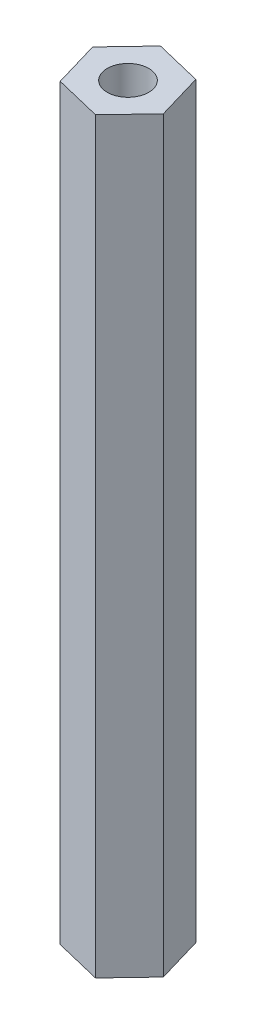
ISO-10303-21;
HEADER;
FILE_DESCRIPTION(('STEP AP214'),'2;1');
FILE_NAME('part.step','',(''),(''),'','','');
FILE_SCHEMA(('AUTOMOTIVE_DESIGN { 1 0 10303 214 1 1 1 1 }'));
ENDSEC;
DATA;
#1=APPLICATION_CONTEXT('core data for automotive mechanical design processes');
#2=APPLICATION_PROTOCOL_DEFINITION('international standard','automotive_design',2000,#1);
#3=PRODUCT_CONTEXT('',#1,'mechanical');
#4=PRODUCT('Part','Part','',(#3));
#5=PRODUCT_RELATED_PRODUCT_CATEGORY('part','',(#4));
#6=PRODUCT_DEFINITION_FORMATION('','',#4);
#7=PRODUCT_DEFINITION_CONTEXT('part definition',#1,'design');
#8=PRODUCT_DEFINITION('design','',#6,#7);
#9=PRODUCT_DEFINITION_SHAPE('','',#8);
#10=(LENGTH_UNIT() NAMED_UNIT(*) SI_UNIT(.MILLI.,.METRE.));
#11=(NAMED_UNIT(*) PLANE_ANGLE_UNIT() SI_UNIT($,.RADIAN.));
#12=(NAMED_UNIT(*) SI_UNIT($,.STERADIAN.) SOLID_ANGLE_UNIT());
#13=UNCERTAINTY_MEASURE_WITH_UNIT(LENGTH_MEASURE(1.E-05),#10,'distance_accuracy_value','');
#14=(GEOMETRIC_REPRESENTATION_CONTEXT(3) GLOBAL_UNCERTAINTY_ASSIGNED_CONTEXT((#13)) GLOBAL_UNIT_ASSIGNED_CONTEXT((#10,
#11,#12)) REPRESENTATION_CONTEXT('',''));
#15=CARTESIAN_POINT('',(0.,0.,0.));
#16=DIRECTION('',(0.,0.,1.));
#17=DIRECTION('',(1.,0.,0.));
#18=AXIS2_PLACEMENT_3D('',#15,#16,#17);
#19=CARTESIAN_POINT('',(0.,27.,0.));
#20=DIRECTION('',(0.,1.,0.));
#21=DIRECTION('',(0.,0.,1.));
#22=AXIS2_PLACEMENT_3D('',#19,#20,#21);
#23=PLANE('',#22);
#24=DIRECTION('',(0.971906320154711,0.,0.235368020009788));
#25=VECTOR('',#24,1.);
#26=CARTESIAN_POINT('',(-2.38949518673463,27.,2.50804959133029));
#27=LINE('',#26,#25);
#28=CARTESIAN_POINT('',(-2.38949518673463,27.,2.50804959133029));
#29=VERTEX_POINT('',#28);
#30=CARTESIAN_POINT('',(0.9772870666759,27.,3.32338832959798));
#31=VERTEX_POINT('',#30);
#32=EDGE_CURVE('E133',#29,#31,#27,.T.);
#33=ORIENTED_EDGE('',*,*,#32,.T.);
#34=DIRECTION('',(0.689787844644276,0.,-0.724011553347738));
#35=VECTOR('',#34,1.);
#36=CARTESIAN_POINT('',(0.9772870666759,27.,3.32338832959798));
#37=LINE('',#36,#35);
#38=CARTESIAN_POINT('',(3.36678225341053,27.,0.815338738267681));
#39=VERTEX_POINT('',#38);
#40=EDGE_CURVE('E91',#31,#39,#37,.T.);
#41=ORIENTED_EDGE('',*,*,#40,.T.);
#42=DIRECTION('',(-0.282118475510435,0.,-0.959379573357526));
#43=VECTOR('',#42,1.);
#44=CARTESIAN_POINT('',(3.36678225341053,27.,0.815338738267681));
#45=LINE('',#44,#43);
#46=CARTESIAN_POINT('',(2.38949518673463,27.,-2.50804959133029));
#47=VERTEX_POINT('',#46);
#48=EDGE_CURVE('E104',#39,#47,#45,.T.);
#49=ORIENTED_EDGE('',*,*,#48,.T.);
#50=DIRECTION('',(-0.971906320154711,0.,-0.235368020009788));
#51=VECTOR('',#50,1.);
#52=CARTESIAN_POINT('',(2.38949518673463,27.,-2.50804959133029));
#53=LINE('',#52,#51);
#54=CARTESIAN_POINT('',(-0.977287066675899,27.,-3.32338832959798));
#55=VERTEX_POINT('',#54);
#56=EDGE_CURVE('E98',#47,#55,#53,.T.);
#57=ORIENTED_EDGE('',*,*,#56,.T.);
#58=DIRECTION('',(-0.689787844644276,0.,0.724011553347738));
#59=VECTOR('',#58,1.);
#60=CARTESIAN_POINT('',(-0.977287066675899,27.,-3.32338832959798));
#61=LINE('',#60,#59);
#62=CARTESIAN_POINT('',(-3.36678225341053,27.,-0.815338738267681));
#63=VERTEX_POINT('',#62);
#64=EDGE_CURVE('E102',#55,#63,#61,.T.);
#65=ORIENTED_EDGE('',*,*,#64,.T.);
#66=DIRECTION('',(0.282118475510435,0.,0.959379573357526));
#67=VECTOR('',#66,1.);
#68=CARTESIAN_POINT('',(-3.36678225341053,27.,-0.815338738267681));
#69=LINE('',#68,#67);
#70=EDGE_CURVE('E54',#63,#29,#69,.T.);
#71=ORIENTED_EDGE('',*,*,#70,.T.);
#72=EDGE_LOOP('',(#33,#41,#49,#57,#65,#71));
#73=FACE_BOUND('',#72,.T.);
#74=CARTESIAN_POINT('',(0.,27.,0.));
#75=DIRECTION('',(0.,1.,0.));
#76=DIRECTION('',(0.,0.,1.));
#77=AXIS2_PLACEMENT_3D('',#74,#75,#76);
#78=CIRCLE('',#77,1.5);
#79=CARTESIAN_POINT('',(0.,27.,1.5));
#80=VERTEX_POINT('',#79);
#81=EDGE_CURVE('E126',#80,#80,#78,.T.);
#82=ORIENTED_EDGE('',*,*,#81,.F.);
#83=EDGE_LOOP('',(#82));
#84=FACE_BOUND('',#83,.T.);
#85=ADVANCED_FACE('F37',(#73,#84),#23,.T.);
#86=CARTESIAN_POINT('',(0.,-27.,0.));
#87=DIRECTION('',(0.,1.,0.));
#88=DIRECTION('',(0.,0.,1.));
#89=AXIS2_PLACEMENT_3D('',#86,#87,#88);
#90=PLANE('',#89);
#91=DIRECTION('',(0.971906320154711,0.,0.235368020009788));
#92=VECTOR('',#91,1.);
#93=CARTESIAN_POINT('',(-2.38949518673463,-27.,2.50804959133029));
#94=LINE('',#93,#92);
#95=CARTESIAN_POINT('',(-2.38949518673463,-27.,2.50804959133029));
#96=VERTEX_POINT('',#95);
#97=CARTESIAN_POINT('',(0.9772870666759,-27.,3.32338832959798));
#98=VERTEX_POINT('',#97);
#99=EDGE_CURVE('E122',#96,#98,#94,.T.);
#100=ORIENTED_EDGE('',*,*,#99,.F.);
#101=DIRECTION('',(0.282118475510435,0.,0.959379573357526));
#102=VECTOR('',#101,1.);
#103=CARTESIAN_POINT('',(-3.36678225341053,-27.,-0.815338738267681));
#104=LINE('',#103,#102);
#105=CARTESIAN_POINT('',(-3.36678225341053,-27.,-0.815338738267681));
#106=VERTEX_POINT('',#105);
#107=EDGE_CURVE('E83',#106,#96,#104,.T.);
#108=ORIENTED_EDGE('',*,*,#107,.F.);
#109=DIRECTION('',(-0.689787844644276,0.,0.724011553347738));
#110=VECTOR('',#109,1.);
#111=CARTESIAN_POINT('',(-0.977287066675899,-27.,-3.32338832959798));
#112=LINE('',#111,#110);
#113=CARTESIAN_POINT('',(-0.977287066675899,-27.,-3.32338832959798));
#114=VERTEX_POINT('',#113);
#115=EDGE_CURVE('E77',#114,#106,#112,.T.);
#116=ORIENTED_EDGE('',*,*,#115,.F.);
#117=DIRECTION('',(-0.971906320154711,0.,-0.235368020009788));
#118=VECTOR('',#117,1.);
#119=CARTESIAN_POINT('',(2.38949518673463,-27.,-2.50804959133029));
#120=LINE('',#119,#118);
#121=CARTESIAN_POINT('',(2.38949518673463,-27.,-2.50804959133029));
#122=VERTEX_POINT('',#121);
#123=EDGE_CURVE('E112',#122,#114,#120,.T.);
#124=ORIENTED_EDGE('',*,*,#123,.F.);
#125=DIRECTION('',(-0.282118475510435,0.,-0.959379573357526));
#126=VECTOR('',#125,1.);
#127=CARTESIAN_POINT('',(3.36678225341053,-27.,0.815338738267681));
#128=LINE('',#127,#126);
#129=CARTESIAN_POINT('',(3.36678225341053,-27.,0.815338738267681));
#130=VERTEX_POINT('',#129);
#131=EDGE_CURVE('E128',#130,#122,#128,.T.);
#132=ORIENTED_EDGE('',*,*,#131,.F.);
#133=DIRECTION('',(0.689787844644276,0.,-0.724011553347738));
#134=VECTOR('',#133,1.);
#135=CARTESIAN_POINT('',(0.9772870666759,-27.,3.32338832959798));
#136=LINE('',#135,#134);
#137=EDGE_CURVE('E125',#98,#130,#136,.T.);
#138=ORIENTED_EDGE('',*,*,#137,.F.);
#139=EDGE_LOOP('',(#100,#108,#116,#124,#132,#138));
#140=FACE_BOUND('',#139,.T.);
#141=CARTESIAN_POINT('',(0.,-27.,0.));
#142=DIRECTION('',(0.,1.,0.));
#143=DIRECTION('',(0.,0.,1.));
#144=AXIS2_PLACEMENT_3D('',#141,#142,#143);
#145=CIRCLE('',#144,1.5);
#146=CARTESIAN_POINT('',(0.,-27.,1.5));
#147=VERTEX_POINT('',#146);
#148=EDGE_CURVE('E226',#147,#147,#145,.T.);
#149=ORIENTED_EDGE('',*,*,#148,.T.);
#150=EDGE_LOOP('',(#149));
#151=FACE_BOUND('',#150,.T.);
#152=ADVANCED_FACE('F142',(#140,#151),#90,.F.);
#153=CARTESIAN_POINT('',(-2.38949518673463,27.,2.50804959133029));
#154=DIRECTION('',(0.235368020009788,0.,-0.971906320154711));
#155=DIRECTION('',(-0.971906320154711,0.,-0.235368020009788));
#156=AXIS2_PLACEMENT_3D('',#153,#154,#155);
#157=PLANE('',#156);
#158=ORIENTED_EDGE('',*,*,#99,.T.);
#159=DIRECTION('',(0.,-1.,0.));
#160=VECTOR('',#159,1.);
#161=CARTESIAN_POINT('',(0.9772870666759,27.,3.32338832959798));
#162=LINE('',#161,#160);
#163=EDGE_CURVE('E11',#31,#98,#162,.T.);
#164=ORIENTED_EDGE('',*,*,#163,.F.);
#165=ORIENTED_EDGE('',*,*,#32,.F.);
#166=DIRECTION('',(0.,-1.,0.));
#167=VECTOR('',#166,1.);
#168=CARTESIAN_POINT('',(-2.38949518673463,27.,2.50804959133029));
#169=LINE('',#168,#167);
#170=EDGE_CURVE('E118',#29,#96,#169,.T.);
#171=ORIENTED_EDGE('',*,*,#170,.T.);
#172=EDGE_LOOP('',(#158,#164,#165,#171));
#173=FACE_BOUND('',#172,.T.);
#174=ADVANCED_FACE('F39',(#173),#157,.F.);
#175=CARTESIAN_POINT('',(0.9772870666759,27.,3.32338832959798));
#176=DIRECTION('',(-0.724011553347738,0.,-0.689787844644276));
#177=DIRECTION('',(-0.689787844644276,0.,0.724011553347738));
#178=AXIS2_PLACEMENT_3D('',#175,#176,#177);
#179=PLANE('',#178);
#180=ORIENTED_EDGE('',*,*,#137,.T.);
#181=DIRECTION('',(0.,-1.,0.));
#182=VECTOR('',#181,1.);
#183=CARTESIAN_POINT('',(3.36678225341053,27.,0.815338738267681));
#184=LINE('',#183,#182);
#185=EDGE_CURVE('E46',#39,#130,#184,.T.);
#186=ORIENTED_EDGE('',*,*,#185,.F.);
#187=ORIENTED_EDGE('',*,*,#40,.F.);
#188=ORIENTED_EDGE('',*,*,#163,.T.);
#189=EDGE_LOOP('',(#180,#186,#187,#188));
#190=FACE_BOUND('',#189,.T.);
#191=ADVANCED_FACE('F167',(#190),#179,.F.);
#192=CARTESIAN_POINT('',(3.36678225341053,27.,0.815338738267681));
#193=DIRECTION('',(-0.959379573357526,0.,0.282118475510435));
#194=DIRECTION('',(0.282118475510435,0.,0.959379573357526));
#195=AXIS2_PLACEMENT_3D('',#192,#193,#194);
#196=PLANE('',#195);
#197=ORIENTED_EDGE('',*,*,#131,.T.);
#198=DIRECTION('',(0.,-1.,0.));
#199=VECTOR('',#198,1.);
#200=CARTESIAN_POINT('',(2.38949518673463,27.,-2.50804959133029));
#201=LINE('',#200,#199);
#202=EDGE_CURVE('E113',#47,#122,#201,.T.);
#203=ORIENTED_EDGE('',*,*,#202,.F.);
#204=ORIENTED_EDGE('',*,*,#48,.F.);
#205=ORIENTED_EDGE('',*,*,#185,.T.);
#206=EDGE_LOOP('',(#197,#203,#204,#205));
#207=FACE_BOUND('',#206,.T.);
#208=ADVANCED_FACE('F139',(#207),#196,.F.);
#209=CARTESIAN_POINT('',(2.38949518673463,27.,-2.50804959133029));
#210=DIRECTION('',(-0.235368020009788,0.,0.971906320154711));
#211=DIRECTION('',(0.971906320154711,0.,0.235368020009788));
#212=AXIS2_PLACEMENT_3D('',#209,#210,#211);
#213=PLANE('',#212);
#214=ORIENTED_EDGE('',*,*,#123,.T.);
#215=DIRECTION('',(0.,-1.,0.));
#216=VECTOR('',#215,1.);
#217=CARTESIAN_POINT('',(-0.977287066675899,27.,-3.32338832959798));
#218=LINE('',#217,#216);
#219=EDGE_CURVE('E109',#55,#114,#218,.T.);
#220=ORIENTED_EDGE('',*,*,#219,.F.);
#221=ORIENTED_EDGE('',*,*,#56,.F.);
#222=ORIENTED_EDGE('',*,*,#202,.T.);
#223=EDGE_LOOP('',(#214,#220,#221,#222));
#224=FACE_BOUND('',#223,.T.);
#225=ADVANCED_FACE('F110',(#224),#213,.F.);
#226=CARTESIAN_POINT('',(-0.977287066675899,27.,-3.32338832959798));
#227=DIRECTION('',(0.724011553347738,0.,0.689787844644276));
#228=DIRECTION('',(0.689787844644276,0.,-0.724011553347738));
#229=AXIS2_PLACEMENT_3D('',#226,#227,#228);
#230=PLANE('',#229);
#231=ORIENTED_EDGE('',*,*,#115,.T.);
#232=DIRECTION('',(0.,-1.,0.));
#233=VECTOR('',#232,1.);
#234=CARTESIAN_POINT('',(-3.36678225341053,27.,-0.815338738267681));
#235=LINE('',#234,#233);
#236=EDGE_CURVE('E114',#63,#106,#235,.T.);
#237=ORIENTED_EDGE('',*,*,#236,.F.);
#238=ORIENTED_EDGE('',*,*,#64,.F.);
#239=ORIENTED_EDGE('',*,*,#219,.T.);
#240=EDGE_LOOP('',(#231,#237,#238,#239));
#241=FACE_BOUND('',#240,.T.);
#242=ADVANCED_FACE('F116',(#241),#230,.F.);
#243=CARTESIAN_POINT('',(-3.36678225341053,27.,-0.815338738267681));
#244=DIRECTION('',(0.959379573357526,0.,-0.282118475510435));
#245=DIRECTION('',(-0.282118475510435,0.,-0.959379573357526));
#246=AXIS2_PLACEMENT_3D('',#243,#244,#245);
#247=PLANE('',#246);
#248=ORIENTED_EDGE('',*,*,#107,.T.);
#249=ORIENTED_EDGE('',*,*,#170,.F.);
#250=ORIENTED_EDGE('',*,*,#70,.F.);
#251=ORIENTED_EDGE('',*,*,#236,.T.);
#252=EDGE_LOOP('',(#248,#249,#250,#251));
#253=FACE_BOUND('',#252,.T.);
#254=ADVANCED_FACE('F147',(#253),#247,.F.);
#255=CARTESIAN_POINT('',(0.,27.,0.));
#256=DIRECTION('',(0.,-1.,0.));
#257=DIRECTION('',(0.,0.,-1.));
#258=AXIS2_PLACEMENT_3D('',#255,#256,#257);
#259=CYLINDRICAL_SURFACE('',#258,1.5);
#260=ORIENTED_EDGE('',*,*,#81,.T.);
#261=EDGE_LOOP('',(#260));
#262=FACE_BOUND('',#261,.T.);
#263=ORIENTED_EDGE('',*,*,#148,.F.);
#264=EDGE_LOOP('',(#263));
#265=FACE_BOUND('',#264,.T.);
#266=ADVANCED_FACE('F149',(#262,#265),#259,.F.);
#267=CLOSED_SHELL('',(#85,#152,#174,#191,#208,#225,#242,#254,#266));
#268=MANIFOLD_SOLID_BREP('B2',#267);
#269=ADVANCED_BREP_SHAPE_REPRESENTATION('',(#18,#268),#14);
#270=SHAPE_DEFINITION_REPRESENTATION(#9,#269);
ENDSEC;
END-ISO-10303-21;
